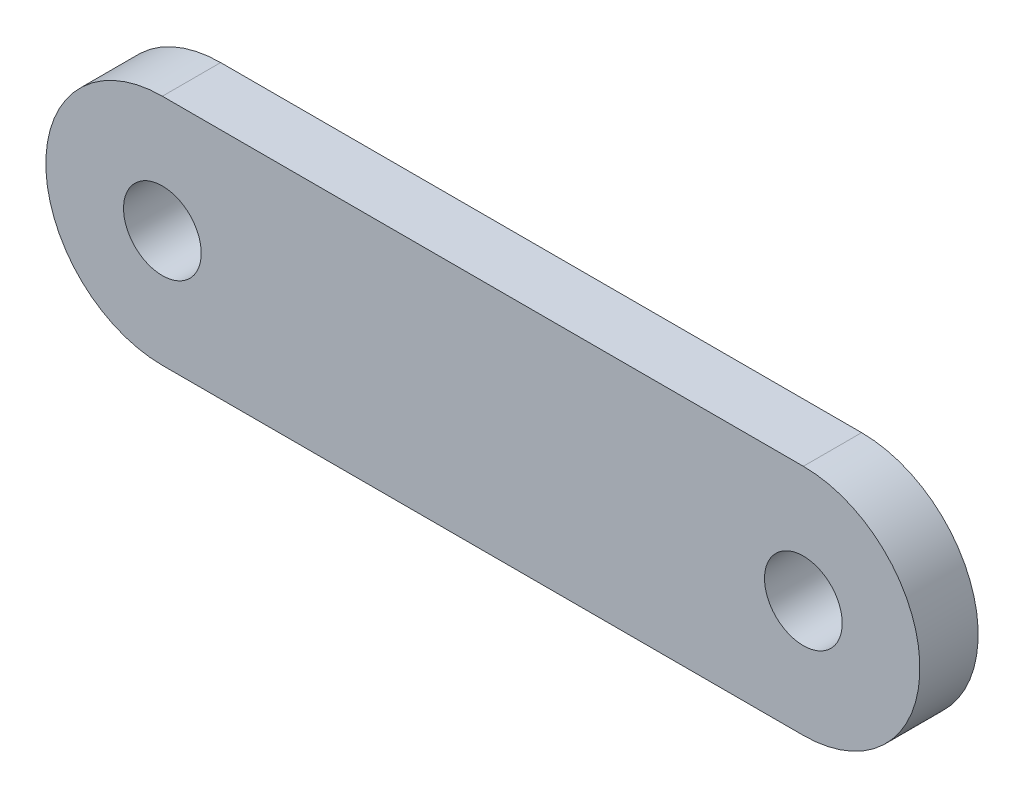
ISO-10303-21;
HEADER;
FILE_DESCRIPTION(('STEP AP214'),'2;1');
FILE_NAME('part.step','',(''),(''),'','','');
FILE_SCHEMA(('AUTOMOTIVE_DESIGN { 1 0 10303 214 1 1 1 1 }'));
ENDSEC;
DATA;
#1=APPLICATION_CONTEXT('core data for automotive mechanical design processes');
#2=APPLICATION_PROTOCOL_DEFINITION('international standard','automotive_design',2000,#1);
#3=PRODUCT_CONTEXT('',#1,'mechanical');
#4=PRODUCT('Part','Part','',(#3));
#5=PRODUCT_RELATED_PRODUCT_CATEGORY('part','',(#4));
#6=PRODUCT_DEFINITION_FORMATION('','',#4);
#7=PRODUCT_DEFINITION_CONTEXT('part definition',#1,'design');
#8=PRODUCT_DEFINITION('design','',#6,#7);
#9=PRODUCT_DEFINITION_SHAPE('','',#8);
#10=(LENGTH_UNIT() NAMED_UNIT(*) SI_UNIT(.MILLI.,.METRE.));
#11=(NAMED_UNIT(*) PLANE_ANGLE_UNIT() SI_UNIT($,.RADIAN.));
#12=(NAMED_UNIT(*) SI_UNIT($,.STERADIAN.) SOLID_ANGLE_UNIT());
#13=UNCERTAINTY_MEASURE_WITH_UNIT(LENGTH_MEASURE(1.E-05),#10,'distance_accuracy_value','');
#14=(GEOMETRIC_REPRESENTATION_CONTEXT(3) GLOBAL_UNCERTAINTY_ASSIGNED_CONTEXT((#13)) GLOBAL_UNIT_ASSIGNED_CONTEXT((#10,
#11,#12)) REPRESENTATION_CONTEXT('',''));
#15=CARTESIAN_POINT('',(0.,0.,0.));
#16=DIRECTION('',(0.,0.,1.));
#17=DIRECTION('',(1.,0.,0.));
#18=AXIS2_PLACEMENT_3D('',#15,#16,#17);
#19=CARTESIAN_POINT('',(0.,-6.,3.));
#20=DIRECTION('',(0.,1.,0.));
#21=DIRECTION('',(-1.,0.,0.));
#22=AXIS2_PLACEMENT_3D('',#19,#20,#21);
#23=PLANE('',#22);
#24=DIRECTION('',(1.,0.,0.));
#25=VECTOR('',#24,1.);
#26=CARTESIAN_POINT('',(0.,-6.,0.));
#27=LINE('',#26,#25);
#28=CARTESIAN_POINT('',(0.,-6.,0.));
#29=VERTEX_POINT('',#28);
#30=CARTESIAN_POINT('',(33.,-6.,0.));
#31=VERTEX_POINT('',#30);
#32=EDGE_CURVE('E107',#29,#31,#27,.T.);
#33=ORIENTED_EDGE('',*,*,#32,.T.);
#34=DIRECTION('',(0.,0.,-1.));
#35=VECTOR('',#34,1.);
#36=CARTESIAN_POINT('',(33.,-6.,3.));
#37=LINE('',#36,#35);
#38=CARTESIAN_POINT('',(33.,-6.,3.));
#39=VERTEX_POINT('',#38);
#40=EDGE_CURVE('E11',#39,#31,#37,.T.);
#41=ORIENTED_EDGE('',*,*,#40,.F.);
#42=DIRECTION('',(1.,0.,0.));
#43=VECTOR('',#42,1.);
#44=CARTESIAN_POINT('',(0.,-6.,3.));
#45=LINE('',#44,#43);
#46=CARTESIAN_POINT('',(0.,-6.,3.));
#47=VERTEX_POINT('',#46);
#48=EDGE_CURVE('E86',#47,#39,#45,.T.);
#49=ORIENTED_EDGE('',*,*,#48,.F.);
#50=DIRECTION('',(0.,0.,-1.));
#51=VECTOR('',#50,1.);
#52=CARTESIAN_POINT('',(0.,-6.,3.));
#53=LINE('',#52,#51);
#54=EDGE_CURVE('E103',#47,#29,#53,.T.);
#55=ORIENTED_EDGE('',*,*,#54,.T.);
#56=EDGE_LOOP('',(#33,#41,#49,#55));
#57=FACE_BOUND('',#56,.T.);
#58=ADVANCED_FACE('F37',(#57),#23,.F.);
#59=CARTESIAN_POINT('',(33.,0.,3.));
#60=DIRECTION('',(0.,0.,-1.));
#61=DIRECTION('',(-1.,0.,0.));
#62=AXIS2_PLACEMENT_3D('',#59,#60,#61);
#63=CYLINDRICAL_SURFACE('',#62,6.);
#64=CARTESIAN_POINT('',(33.,0.,0.));
#65=DIRECTION('',(0.,0.,1.));
#66=DIRECTION('',(1.,0.,0.));
#67=AXIS2_PLACEMENT_3D('',#64,#65,#66);
#68=CIRCLE('',#67,6.);
#69=CARTESIAN_POINT('',(33.,6.,0.));
#70=VERTEX_POINT('',#69);
#71=EDGE_CURVE('E91',#31,#70,#68,.T.);
#72=ORIENTED_EDGE('',*,*,#71,.T.);
#73=DIRECTION('',(0.,0.,-1.));
#74=VECTOR('',#73,1.);
#75=CARTESIAN_POINT('',(33.,6.,3.));
#76=LINE('',#75,#74);
#77=CARTESIAN_POINT('',(33.,6.,3.));
#78=VERTEX_POINT('',#77);
#79=EDGE_CURVE('E46',#78,#70,#76,.T.);
#80=ORIENTED_EDGE('',*,*,#79,.F.);
#81=CARTESIAN_POINT('',(33.,0.,3.));
#82=DIRECTION('',(0.,0.,1.));
#83=DIRECTION('',(1.,0.,0.));
#84=AXIS2_PLACEMENT_3D('',#81,#82,#83);
#85=CIRCLE('',#84,6.);
#86=EDGE_CURVE('E80',#39,#78,#85,.T.);
#87=ORIENTED_EDGE('',*,*,#86,.F.);
#88=ORIENTED_EDGE('',*,*,#40,.T.);
#89=EDGE_LOOP('',(#72,#80,#87,#88));
#90=FACE_BOUND('',#89,.T.);
#91=ADVANCED_FACE('F90',(#90),#63,.T.);
#92=CARTESIAN_POINT('',(0.,6.,3.));
#93=DIRECTION('',(0.,1.,0.));
#94=DIRECTION('',(-1.,0.,0.));
#95=AXIS2_PLACEMENT_3D('',#92,#93,#94);
#96=PLANE('',#95);
#97=DIRECTION('',(1.,0.,0.));
#98=VECTOR('',#97,1.);
#99=CARTESIAN_POINT('',(0.,6.,0.));
#100=LINE('',#99,#98);
#101=CARTESIAN_POINT('',(0.,6.,0.));
#102=VERTEX_POINT('',#101);
#103=EDGE_CURVE('E111',#102,#70,#100,.T.);
#104=ORIENTED_EDGE('',*,*,#103,.F.);
#105=DIRECTION('',(0.,0.,-1.));
#106=VECTOR('',#105,1.);
#107=CARTESIAN_POINT('',(0.,6.,3.));
#108=LINE('',#107,#106);
#109=CARTESIAN_POINT('',(0.,6.,3.));
#110=VERTEX_POINT('',#109);
#111=EDGE_CURVE('E70',#110,#102,#108,.T.);
#112=ORIENTED_EDGE('',*,*,#111,.F.);
#113=DIRECTION('',(1.,0.,0.));
#114=VECTOR('',#113,1.);
#115=CARTESIAN_POINT('',(0.,6.,3.));
#116=LINE('',#115,#114);
#117=EDGE_CURVE('E84',#110,#78,#116,.T.);
#118=ORIENTED_EDGE('',*,*,#117,.T.);
#119=ORIENTED_EDGE('',*,*,#79,.T.);
#120=EDGE_LOOP('',(#104,#112,#118,#119));
#121=FACE_BOUND('',#120,.T.);
#122=ADVANCED_FACE('F95',(#121),#96,.T.);
#123=CARTESIAN_POINT('',(0.,0.,3.));
#124=DIRECTION('',(0.,0.,-1.));
#125=DIRECTION('',(-1.,0.,0.));
#126=AXIS2_PLACEMENT_3D('',#123,#124,#125);
#127=CYLINDRICAL_SURFACE('',#126,6.);
#128=CARTESIAN_POINT('',(0.,0.,0.));
#129=DIRECTION('',(0.,0.,1.));
#130=DIRECTION('',(1.,0.,0.));
#131=AXIS2_PLACEMENT_3D('',#128,#129,#130);
#132=CIRCLE('',#131,6.);
#133=EDGE_CURVE('E73',#102,#29,#132,.T.);
#134=ORIENTED_EDGE('',*,*,#133,.T.);
#135=ORIENTED_EDGE('',*,*,#54,.F.);
#136=CARTESIAN_POINT('',(0.,0.,3.));
#137=DIRECTION('',(0.,0.,1.));
#138=DIRECTION('',(1.,0.,0.));
#139=AXIS2_PLACEMENT_3D('',#136,#137,#138);
#140=CIRCLE('',#139,6.);
#141=EDGE_CURVE('E54',#110,#47,#140,.T.);
#142=ORIENTED_EDGE('',*,*,#141,.F.);
#143=ORIENTED_EDGE('',*,*,#111,.T.);
#144=EDGE_LOOP('',(#134,#135,#142,#143));
#145=FACE_BOUND('',#144,.T.);
#146=ADVANCED_FACE('F139',(#145),#127,.T.);
#147=CARTESIAN_POINT('',(0.,0.,3.));
#148=DIRECTION('',(0.,0.,-1.));
#149=DIRECTION('',(-1.,0.,0.));
#150=AXIS2_PLACEMENT_3D('',#147,#148,#149);
#151=CYLINDRICAL_SURFACE('',#150,2.);
#152=CARTESIAN_POINT('',(0.,0.,3.));
#153=DIRECTION('',(0.,0.,1.));
#154=DIRECTION('',(1.,0.,0.));
#155=AXIS2_PLACEMENT_3D('',#152,#153,#154);
#156=CIRCLE('',#155,2.);
#157=CARTESIAN_POINT('',(2.,0.,3.));
#158=VERTEX_POINT('',#157);
#159=EDGE_CURVE('E117',#158,#158,#156,.T.);
#160=ORIENTED_EDGE('',*,*,#159,.T.);
#161=EDGE_LOOP('',(#160));
#162=FACE_BOUND('',#161,.T.);
#163=CARTESIAN_POINT('',(0.,0.,0.));
#164=DIRECTION('',(0.,0.,1.));
#165=DIRECTION('',(1.,0.,0.));
#166=AXIS2_PLACEMENT_3D('',#163,#164,#165);
#167=CIRCLE('',#166,2.);
#168=CARTESIAN_POINT('',(2.,0.,0.));
#169=VERTEX_POINT('',#168);
#170=EDGE_CURVE('E104',#169,#169,#167,.T.);
#171=ORIENTED_EDGE('',*,*,#170,.F.);
#172=EDGE_LOOP('',(#171));
#173=FACE_BOUND('',#172,.T.);
#174=ADVANCED_FACE('F39',(#162,#173),#151,.F.);
#175=CARTESIAN_POINT('',(33.,0.,3.));
#176=DIRECTION('',(0.,0.,-1.));
#177=DIRECTION('',(-1.,0.,0.));
#178=AXIS2_PLACEMENT_3D('',#175,#176,#177);
#179=CYLINDRICAL_SURFACE('',#178,2.);
#180=CARTESIAN_POINT('',(33.,0.,3.));
#181=DIRECTION('',(0.,0.,1.));
#182=DIRECTION('',(1.,0.,0.));
#183=AXIS2_PLACEMENT_3D('',#180,#181,#182);
#184=CIRCLE('',#183,2.);
#185=CARTESIAN_POINT('',(35.,0.,3.));
#186=VERTEX_POINT('',#185);
#187=EDGE_CURVE('E97',#186,#186,#184,.T.);
#188=ORIENTED_EDGE('',*,*,#187,.T.);
#189=EDGE_LOOP('',(#188));
#190=FACE_BOUND('',#189,.T.);
#191=CARTESIAN_POINT('',(33.,0.,0.));
#192=DIRECTION('',(0.,0.,1.));
#193=DIRECTION('',(1.,0.,0.));
#194=AXIS2_PLACEMENT_3D('',#191,#192,#193);
#195=CIRCLE('',#194,2.);
#196=CARTESIAN_POINT('',(35.,0.,0.));
#197=VERTEX_POINT('',#196);
#198=EDGE_CURVE('E114',#197,#197,#195,.T.);
#199=ORIENTED_EDGE('',*,*,#198,.F.);
#200=EDGE_LOOP('',(#199));
#201=FACE_BOUND('',#200,.T.);
#202=ADVANCED_FACE('F129',(#190,#201),#179,.F.);
#203=CARTESIAN_POINT('',(0.,0.,3.));
#204=DIRECTION('',(0.,0.,1.));
#205=DIRECTION('',(1.,0.,0.));
#206=AXIS2_PLACEMENT_3D('',#203,#204,#205);
#207=PLANE('',#206);
#208=ORIENTED_EDGE('',*,*,#159,.F.);
#209=EDGE_LOOP('',(#208));
#210=FACE_BOUND('',#209,.T.);
#211=ORIENTED_EDGE('',*,*,#48,.T.);
#212=ORIENTED_EDGE('',*,*,#86,.T.);
#213=ORIENTED_EDGE('',*,*,#117,.F.);
#214=ORIENTED_EDGE('',*,*,#141,.T.);
#215=EDGE_LOOP('',(#211,#212,#213,#214));
#216=FACE_BOUND('',#215,.T.);
#217=ORIENTED_EDGE('',*,*,#187,.F.);
#218=EDGE_LOOP('',(#217));
#219=FACE_BOUND('',#218,.T.);
#220=ADVANCED_FACE('F81',(#210,#216,#219),#207,.T.);
#221=CARTESIAN_POINT('',(0.,0.,0.));
#222=DIRECTION('',(0.,0.,1.));
#223=DIRECTION('',(1.,0.,0.));
#224=AXIS2_PLACEMENT_3D('',#221,#222,#223);
#225=PLANE('',#224);
#226=ORIENTED_EDGE('',*,*,#170,.T.);
#227=EDGE_LOOP('',(#226));
#228=FACE_BOUND('',#227,.T.);
#229=ORIENTED_EDGE('',*,*,#32,.F.);
#230=ORIENTED_EDGE('',*,*,#133,.F.);
#231=ORIENTED_EDGE('',*,*,#103,.T.);
#232=ORIENTED_EDGE('',*,*,#71,.F.);
#233=EDGE_LOOP('',(#229,#230,#231,#232));
#234=FACE_BOUND('',#233,.T.);
#235=ORIENTED_EDGE('',*,*,#198,.T.);
#236=EDGE_LOOP('',(#235));
#237=FACE_BOUND('',#236,.T.);
#238=ADVANCED_FACE('F122',(#228,#234,#237),#225,.F.);
#239=CLOSED_SHELL('',(#58,#91,#122,#146,#174,#202,#220,#238));
#240=MANIFOLD_SOLID_BREP('B2',#239);
#241=ADVANCED_BREP_SHAPE_REPRESENTATION('',(#18,#240),#14);
#242=SHAPE_DEFINITION_REPRESENTATION(#9,#241);
ENDSEC;
END-ISO-10303-21;
